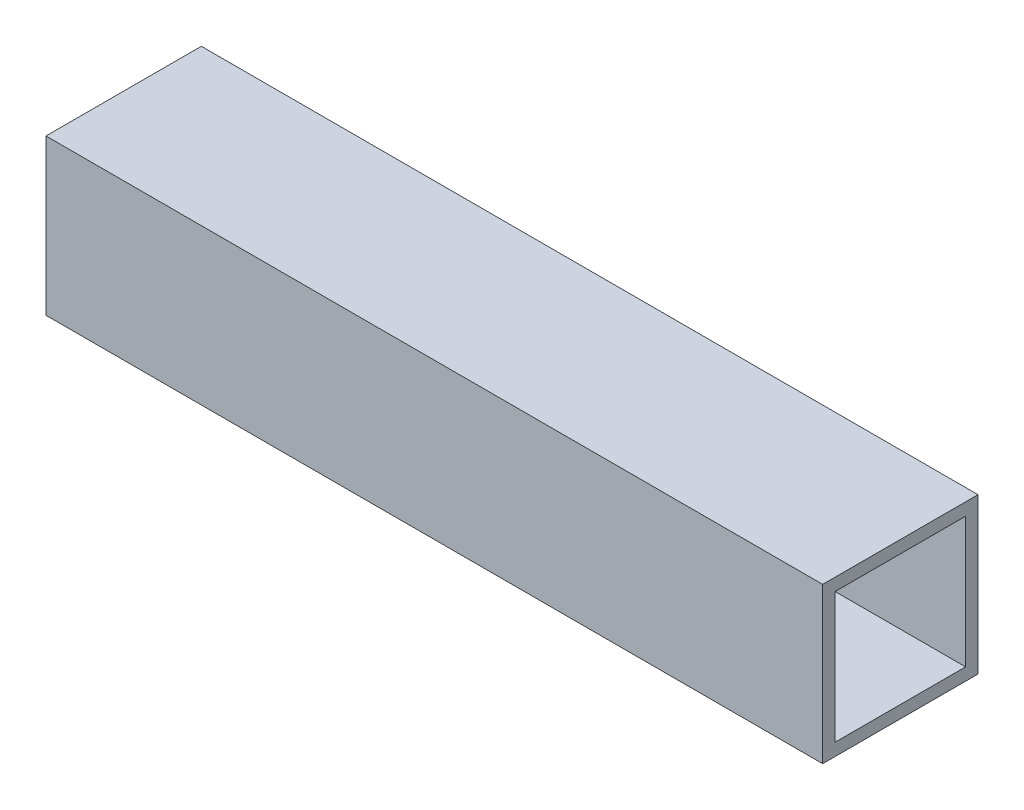
ISO-10303-21;
HEADER;
FILE_DESCRIPTION(('STEP AP214'),'2;1');
FILE_NAME('part.step','',(''),(''),'','','');
FILE_SCHEMA(('AUTOMOTIVE_DESIGN { 1 0 10303 214 1 1 1 1 }'));
ENDSEC;
DATA;
#1=APPLICATION_CONTEXT('core data for automotive mechanical design processes');
#2=APPLICATION_PROTOCOL_DEFINITION('international standard','automotive_design',2000,#1);
#3=PRODUCT_CONTEXT('',#1,'mechanical');
#4=PRODUCT('Part','Part','',(#3));
#5=PRODUCT_RELATED_PRODUCT_CATEGORY('part','',(#4));
#6=PRODUCT_DEFINITION_FORMATION('','',#4);
#7=PRODUCT_DEFINITION_CONTEXT('part definition',#1,'design');
#8=PRODUCT_DEFINITION('design','',#6,#7);
#9=PRODUCT_DEFINITION_SHAPE('','',#8);
#10=(LENGTH_UNIT() NAMED_UNIT(*) SI_UNIT(.MILLI.,.METRE.));
#11=(NAMED_UNIT(*) PLANE_ANGLE_UNIT() SI_UNIT($,.RADIAN.));
#12=(NAMED_UNIT(*) SI_UNIT($,.STERADIAN.) SOLID_ANGLE_UNIT());
#13=UNCERTAINTY_MEASURE_WITH_UNIT(LENGTH_MEASURE(1.E-05),#10,'distance_accuracy_value','');
#14=(GEOMETRIC_REPRESENTATION_CONTEXT(3) GLOBAL_UNCERTAINTY_ASSIGNED_CONTEXT((#13)) GLOBAL_UNIT_ASSIGNED_CONTEXT((#10,
#11,#12)) REPRESENTATION_CONTEXT('',''));
#15=CARTESIAN_POINT('',(0.,0.,0.));
#16=DIRECTION('',(0.,0.,1.));
#17=DIRECTION('',(1.,0.,0.));
#18=AXIS2_PLACEMENT_3D('',#15,#16,#17);
#19=CARTESIAN_POINT('',(50.,-79.9999999999998,-1093.90650742338));
#20=DIRECTION('',(1.,0.,0.));
#21=DIRECTION('',(0.,0.,-1.));
#22=AXIS2_PLACEMENT_3D('',#19,#20,#21);
#23=PLANE('',#22);
#24=DIRECTION('',(0.,1.,0.));
#25=VECTOR('',#24,1.);
#26=CARTESIAN_POINT('',(50.,-89.9999999999999,-1095.));
#27=LINE('',#26,#25);
#28=CARTESIAN_POINT('',(50.,-89.9999999999998,-1095.));
#29=VERTEX_POINT('',#28);
#30=CARTESIAN_POINT('',(50.,-69.9999999999998,-1095.));
#31=VERTEX_POINT('',#30);
#32=EDGE_CURVE('E134',#29,#31,#27,.T.);
#33=ORIENTED_EDGE('',*,*,#32,.T.);
#34=DIRECTION('',(0.,0.,1.));
#35=VECTOR('',#34,1.);
#36=CARTESIAN_POINT('',(50.,-69.9999999999999,-1075.));
#37=LINE('',#36,#35);
#38=CARTESIAN_POINT('',(50.,-69.9999999999999,-1075.));
#39=VERTEX_POINT('',#38);
#40=EDGE_CURVE('E84',#31,#39,#37,.T.);
#41=ORIENTED_EDGE('',*,*,#40,.T.);
#42=DIRECTION('',(0.,-1.,0.));
#43=VECTOR('',#42,1.);
#44=CARTESIAN_POINT('',(50.,-89.9999999999999,-1075.));
#45=LINE('',#44,#43);
#46=CARTESIAN_POINT('',(50.,-89.9999999999999,-1075.));
#47=VERTEX_POINT('',#46);
#48=EDGE_CURVE('E139',#39,#47,#45,.T.);
#49=ORIENTED_EDGE('',*,*,#48,.T.);
#50=DIRECTION('',(0.,0.,-1.));
#51=VECTOR('',#50,1.);
#52=CARTESIAN_POINT('',(50.,-89.9999999999999,-1075.));
#53=LINE('',#52,#51);
#54=EDGE_CURVE('E132',#47,#29,#53,.T.);
#55=ORIENTED_EDGE('',*,*,#54,.T.);
#56=EDGE_LOOP('',(#33,#41,#49,#55));
#57=FACE_BOUND('',#56,.T.);
#58=DIRECTION('',(0.,0.,-1.));
#59=VECTOR('',#58,1.);
#60=CARTESIAN_POINT('',(50.,-88.3999999999999,-1076.6));
#61=LINE('',#60,#59);
#62=CARTESIAN_POINT('',(50.,-88.3999999999999,-1076.6));
#63=VERTEX_POINT('',#62);
#64=CARTESIAN_POINT('',(50.,-88.3999999999999,-1093.4));
#65=VERTEX_POINT('',#64);
#66=EDGE_CURVE('E48',#63,#65,#61,.T.);
#67=ORIENTED_EDGE('',*,*,#66,.F.);
#68=DIRECTION('',(0.,-1.,0.));
#69=VECTOR('',#68,1.);
#70=CARTESIAN_POINT('',(50.,-88.3999999999999,-1076.6));
#71=LINE('',#70,#69);
#72=CARTESIAN_POINT('',(50.,-71.5999999999999,-1076.6));
#73=VERTEX_POINT('',#72);
#74=EDGE_CURVE('E143',#73,#63,#71,.T.);
#75=ORIENTED_EDGE('',*,*,#74,.F.);
#76=DIRECTION('',(0.,0.,1.));
#77=VECTOR('',#76,1.);
#78=CARTESIAN_POINT('',(50.,-71.5999999999999,-1076.6));
#79=LINE('',#78,#77);
#80=CARTESIAN_POINT('',(50.,-71.5999999999999,-1093.4));
#81=VERTEX_POINT('',#80);
#82=EDGE_CURVE('E135',#81,#73,#79,.T.);
#83=ORIENTED_EDGE('',*,*,#82,.F.);
#84=DIRECTION('',(0.,1.,0.));
#85=VECTOR('',#84,1.);
#86=CARTESIAN_POINT('',(50.,-88.3999999999999,-1093.4));
#87=LINE('',#86,#85);
#88=EDGE_CURVE('E117',#65,#81,#87,.T.);
#89=ORIENTED_EDGE('',*,*,#88,.F.);
#90=EDGE_LOOP('',(#67,#75,#83,#89));
#91=FACE_BOUND('',#90,.T.);
#92=ADVANCED_FACE('F39',(#57,#91),#23,.T.);
#93=CARTESIAN_POINT('',(-50.0000000000002,-89.9999999999998,-1085.));
#94=DIRECTION('',(-1.,0.,0.));
#95=DIRECTION('',(0.,0.,1.));
#96=AXIS2_PLACEMENT_3D('',#93,#94,#95);
#97=PLANE('',#96);
#98=DIRECTION('',(0.,-1.,0.));
#99=VECTOR('',#98,1.);
#100=CARTESIAN_POINT('',(-50.0000000000002,-89.9999999999999,-1095.));
#101=LINE('',#100,#99);
#102=CARTESIAN_POINT('',(-50.0000000000002,-69.9999999999998,-1095.));
#103=VERTEX_POINT('',#102);
#104=CARTESIAN_POINT('',(-50.0000000000002,-89.9999999999998,-1095.));
#105=VERTEX_POINT('',#104);
#106=EDGE_CURVE('E130',#103,#105,#101,.T.);
#107=ORIENTED_EDGE('',*,*,#106,.T.);
#108=DIRECTION('',(0.,0.,1.));
#109=VECTOR('',#108,1.);
#110=CARTESIAN_POINT('',(-50.0000000000002,-89.9999999999999,-1075.));
#111=LINE('',#110,#109);
#112=CARTESIAN_POINT('',(-50.0000000000002,-89.9999999999999,-1075.));
#113=VERTEX_POINT('',#112);
#114=EDGE_CURVE('E124',#105,#113,#111,.T.);
#115=ORIENTED_EDGE('',*,*,#114,.T.);
#116=DIRECTION('',(0.,1.,0.));
#117=VECTOR('',#116,1.);
#118=CARTESIAN_POINT('',(-50.0000000000002,-89.9999999999999,-1075.));
#119=LINE('',#118,#117);
#120=CARTESIAN_POINT('',(-50.0000000000002,-69.9999999999999,-1075.));
#121=VERTEX_POINT('',#120);
#122=EDGE_CURVE('E122',#113,#121,#119,.T.);
#123=ORIENTED_EDGE('',*,*,#122,.T.);
#124=DIRECTION('',(0.,0.,-1.));
#125=VECTOR('',#124,1.);
#126=CARTESIAN_POINT('',(-50.0000000000002,-69.9999999999998,-1085.));
#127=LINE('',#126,#125);
#128=EDGE_CURVE('E91',#121,#103,#127,.T.);
#129=ORIENTED_EDGE('',*,*,#128,.T.);
#130=EDGE_LOOP('',(#107,#115,#123,#129));
#131=FACE_BOUND('',#130,.T.);
#132=DIRECTION('',(0.,1.,0.));
#133=VECTOR('',#132,1.);
#134=CARTESIAN_POINT('',(-50.0000000000002,-88.3999999999999,-1076.6));
#135=LINE('',#134,#133);
#136=CARTESIAN_POINT('',(-50.0000000000002,-88.3999999999999,-1076.6));
#137=VERTEX_POINT('',#136);
#138=CARTESIAN_POINT('',(-50.0000000000002,-71.5999999999999,-1076.6));
#139=VERTEX_POINT('',#138);
#140=EDGE_CURVE('E109',#137,#139,#135,.T.);
#141=ORIENTED_EDGE('',*,*,#140,.F.);
#142=DIRECTION('',(0.,0.,1.));
#143=VECTOR('',#142,1.);
#144=CARTESIAN_POINT('',(-50.0000000000002,-88.3999999999999,-1076.6));
#145=LINE('',#144,#143);
#146=CARTESIAN_POINT('',(-50.0000000000002,-88.3999999999999,-1093.4));
#147=VERTEX_POINT('',#146);
#148=EDGE_CURVE('E11',#147,#137,#145,.T.);
#149=ORIENTED_EDGE('',*,*,#148,.F.);
#150=DIRECTION('',(0.,-1.,0.));
#151=VECTOR('',#150,1.);
#152=CARTESIAN_POINT('',(-50.0000000000002,-88.3999999999999,-1093.4));
#153=LINE('',#152,#151);
#154=CARTESIAN_POINT('',(-50.0000000000002,-71.5999999999999,-1093.4));
#155=VERTEX_POINT('',#154);
#156=EDGE_CURVE('E107',#155,#147,#153,.T.);
#157=ORIENTED_EDGE('',*,*,#156,.F.);
#158=DIRECTION('',(0.,0.,-1.));
#159=VECTOR('',#158,1.);
#160=CARTESIAN_POINT('',(-50.0000000000002,-71.5999999999999,-1076.6));
#161=LINE('',#160,#159);
#162=EDGE_CURVE('E150',#139,#155,#161,.T.);
#163=ORIENTED_EDGE('',*,*,#162,.F.);
#164=EDGE_LOOP('',(#141,#149,#157,#163));
#165=FACE_BOUND('',#164,.T.);
#166=ADVANCED_FACE('F105',(#131,#165),#97,.T.);
#167=CARTESIAN_POINT('',(-59.9999999999999,-88.3999999999999,-1093.4));
#168=DIRECTION('',(0.,0.,1.));
#169=DIRECTION('',(1.,0.,0.));
#170=AXIS2_PLACEMENT_3D('',#167,#168,#169);
#171=PLANE('',#170);
#172=DIRECTION('',(1.,0.,0.));
#173=VECTOR('',#172,1.);
#174=CARTESIAN_POINT('',(-59.9999999999999,-88.3999999999999,-1093.4));
#175=LINE('',#174,#173);
#176=EDGE_CURVE('E42',#147,#65,#175,.T.);
#177=ORIENTED_EDGE('',*,*,#176,.T.);
#178=ORIENTED_EDGE('',*,*,#88,.T.);
#179=DIRECTION('',(1.,0.,0.));
#180=VECTOR('',#179,1.);
#181=CARTESIAN_POINT('',(-59.9999999999999,-71.5999999999999,-1093.4));
#182=LINE('',#181,#180);
#183=EDGE_CURVE('E115',#155,#81,#182,.T.);
#184=ORIENTED_EDGE('',*,*,#183,.F.);
#185=ORIENTED_EDGE('',*,*,#156,.T.);
#186=EDGE_LOOP('',(#177,#178,#184,#185));
#187=FACE_BOUND('',#186,.T.);
#188=ADVANCED_FACE('F112',(#187),#171,.T.);
#189=CARTESIAN_POINT('',(-59.9999999999999,-89.9999999999999,-1095.));
#190=DIRECTION('',(0.,0.,1.));
#191=DIRECTION('',(1.,0.,0.));
#192=AXIS2_PLACEMENT_3D('',#189,#190,#191);
#193=PLANE('',#192);
#194=ORIENTED_EDGE('',*,*,#32,.F.);
#195=DIRECTION('',(1.,0.,0.));
#196=VECTOR('',#195,1.);
#197=CARTESIAN_POINT('',(-59.9999999999999,-89.9999999999999,-1095.));
#198=LINE('',#197,#196);
#199=EDGE_CURVE('E153',#105,#29,#198,.T.);
#200=ORIENTED_EDGE('',*,*,#199,.F.);
#201=ORIENTED_EDGE('',*,*,#106,.F.);
#202=DIRECTION('',(1.,0.,0.));
#203=VECTOR('',#202,1.);
#204=CARTESIAN_POINT('',(-59.9999999999999,-69.9999999999999,-1095.));
#205=LINE('',#204,#203);
#206=EDGE_CURVE('E116',#103,#31,#205,.T.);
#207=ORIENTED_EDGE('',*,*,#206,.T.);
#208=EDGE_LOOP('',(#194,#200,#201,#207));
#209=FACE_BOUND('',#208,.T.);
#210=ADVANCED_FACE('F164',(#209),#193,.F.);
#211=CARTESIAN_POINT('',(-59.9999999999999,-71.5999999999999,-1076.6));
#212=DIRECTION('',(0.,-1.,0.));
#213=DIRECTION('',(0.,0.,-1.));
#214=AXIS2_PLACEMENT_3D('',#211,#212,#213);
#215=PLANE('',#214);
#216=ORIENTED_EDGE('',*,*,#82,.T.);
#217=DIRECTION('',(1.,0.,0.));
#218=VECTOR('',#217,1.);
#219=CARTESIAN_POINT('',(-59.9999999999999,-71.5999999999999,-1076.6));
#220=LINE('',#219,#218);
#221=EDGE_CURVE('E146',#139,#73,#220,.T.);
#222=ORIENTED_EDGE('',*,*,#221,.F.);
#223=ORIENTED_EDGE('',*,*,#162,.T.);
#224=ORIENTED_EDGE('',*,*,#183,.T.);
#225=EDGE_LOOP('',(#216,#222,#223,#224));
#226=FACE_BOUND('',#225,.T.);
#227=ADVANCED_FACE('F183',(#226),#215,.T.);
#228=CARTESIAN_POINT('',(-59.9999999999999,-88.3999999999999,-1076.6));
#229=DIRECTION('',(0.,0.,-1.));
#230=DIRECTION('',(-1.,0.,0.));
#231=AXIS2_PLACEMENT_3D('',#228,#229,#230);
#232=PLANE('',#231);
#233=ORIENTED_EDGE('',*,*,#221,.T.);
#234=ORIENTED_EDGE('',*,*,#74,.T.);
#235=DIRECTION('',(1.,0.,0.));
#236=VECTOR('',#235,1.);
#237=CARTESIAN_POINT('',(-59.9999999999999,-88.3999999999999,-1076.6));
#238=LINE('',#237,#236);
#239=EDGE_CURVE('E148',#137,#63,#238,.T.);
#240=ORIENTED_EDGE('',*,*,#239,.F.);
#241=ORIENTED_EDGE('',*,*,#140,.T.);
#242=EDGE_LOOP('',(#233,#234,#240,#241));
#243=FACE_BOUND('',#242,.T.);
#244=ADVANCED_FACE('F185',(#243),#232,.T.);
#245=CARTESIAN_POINT('',(-59.9999999999999,-89.9999999999999,-1075.));
#246=DIRECTION('',(0.,1.,0.));
#247=DIRECTION('',(0.,0.,1.));
#248=AXIS2_PLACEMENT_3D('',#245,#246,#247);
#249=PLANE('',#248);
#250=ORIENTED_EDGE('',*,*,#54,.F.);
#251=DIRECTION('',(1.,0.,0.));
#252=VECTOR('',#251,1.);
#253=CARTESIAN_POINT('',(-59.9999999999999,-89.9999999999999,-1075.));
#254=LINE('',#253,#252);
#255=EDGE_CURVE('E156',#113,#47,#254,.T.);
#256=ORIENTED_EDGE('',*,*,#255,.F.);
#257=ORIENTED_EDGE('',*,*,#114,.F.);
#258=ORIENTED_EDGE('',*,*,#199,.T.);
#259=EDGE_LOOP('',(#250,#256,#257,#258));
#260=FACE_BOUND('',#259,.T.);
#261=ADVANCED_FACE('F206',(#260),#249,.F.);
#262=CARTESIAN_POINT('',(-59.9999999999999,-89.9999999999999,-1075.));
#263=DIRECTION('',(0.,0.,-1.));
#264=DIRECTION('',(-1.,0.,0.));
#265=AXIS2_PLACEMENT_3D('',#262,#263,#264);
#266=PLANE('',#265);
#267=ORIENTED_EDGE('',*,*,#48,.F.);
#268=DIRECTION('',(1.,0.,0.));
#269=VECTOR('',#268,1.);
#270=CARTESIAN_POINT('',(-59.9999999999999,-69.9999999999999,-1075.));
#271=LINE('',#270,#269);
#272=EDGE_CURVE('E159',#121,#39,#271,.T.);
#273=ORIENTED_EDGE('',*,*,#272,.F.);
#274=ORIENTED_EDGE('',*,*,#122,.F.);
#275=ORIENTED_EDGE('',*,*,#255,.T.);
#276=EDGE_LOOP('',(#267,#273,#274,#275));
#277=FACE_BOUND('',#276,.T.);
#278=ADVANCED_FACE('F170',(#277),#266,.F.);
#279=CARTESIAN_POINT('',(-59.9999999999999,-69.9999999999999,-1075.));
#280=DIRECTION('',(0.,-1.,0.));
#281=DIRECTION('',(0.,0.,-1.));
#282=AXIS2_PLACEMENT_3D('',#279,#280,#281);
#283=PLANE('',#282);
#284=ORIENTED_EDGE('',*,*,#40,.F.);
#285=ORIENTED_EDGE('',*,*,#206,.F.);
#286=ORIENTED_EDGE('',*,*,#128,.F.);
#287=ORIENTED_EDGE('',*,*,#272,.T.);
#288=EDGE_LOOP('',(#284,#285,#286,#287));
#289=FACE_BOUND('',#288,.T.);
#290=ADVANCED_FACE('F166',(#289),#283,.F.);
#291=CARTESIAN_POINT('',(-59.9999999999999,-88.3999999999999,-1076.6));
#292=DIRECTION('',(0.,1.,0.));
#293=DIRECTION('',(0.,0.,1.));
#294=AXIS2_PLACEMENT_3D('',#291,#292,#293);
#295=PLANE('',#294);
#296=ORIENTED_EDGE('',*,*,#239,.T.);
#297=ORIENTED_EDGE('',*,*,#66,.T.);
#298=ORIENTED_EDGE('',*,*,#176,.F.);
#299=ORIENTED_EDGE('',*,*,#148,.T.);
#300=EDGE_LOOP('',(#296,#297,#298,#299));
#301=FACE_BOUND('',#300,.T.);
#302=ADVANCED_FACE('F119',(#301),#295,.T.);
#303=CLOSED_SHELL('',(#92,#166,#188,#210,#227,#244,#261,#278,#290,#302));
#304=MANIFOLD_SOLID_BREP('B2',#303);
#305=ADVANCED_BREP_SHAPE_REPRESENTATION('',(#18,#304),#14);
#306=SHAPE_DEFINITION_REPRESENTATION(#9,#305);
ENDSEC;
END-ISO-10303-21;
